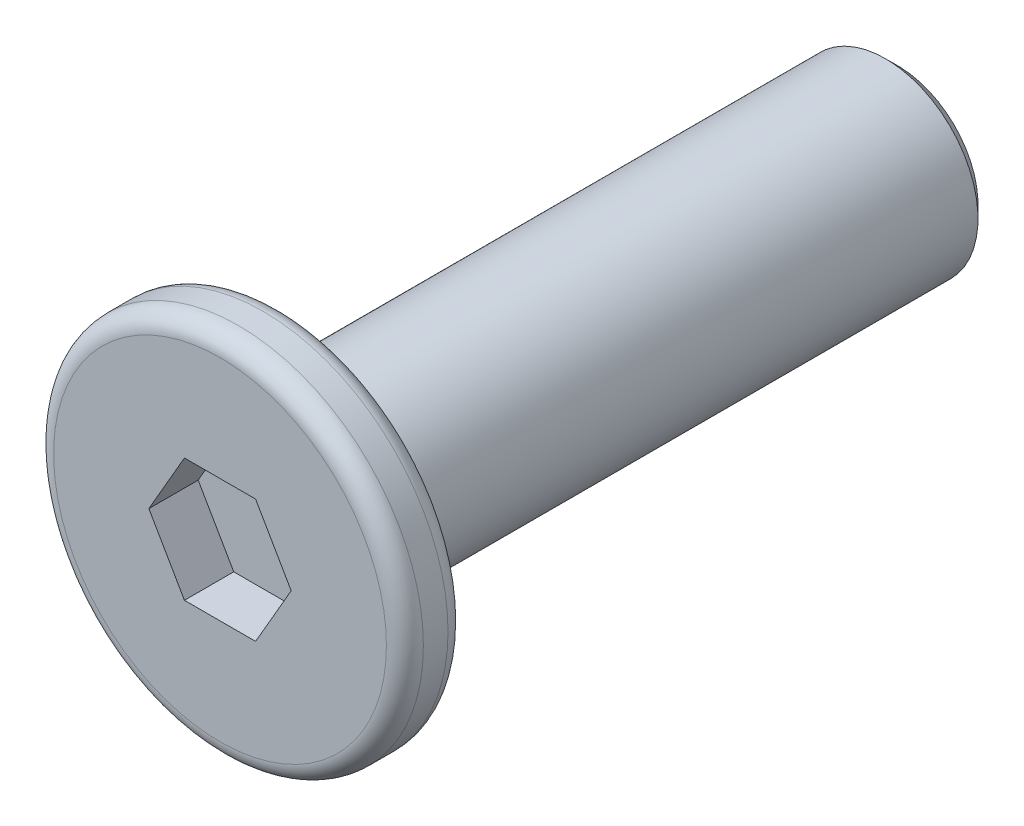
ISO-10303-21;
HEADER;
FILE_DESCRIPTION(('STEP AP214'),'2;1');
FILE_NAME('part.step','',(''),(''),'','','');
FILE_SCHEMA(('AUTOMOTIVE_DESIGN { 1 0 10303 214 1 1 1 1 }'));
ENDSEC;
DATA;
#1=APPLICATION_CONTEXT('core data for automotive mechanical design processes');
#2=APPLICATION_PROTOCOL_DEFINITION('international standard','automotive_design',2000,#1);
#3=PRODUCT_CONTEXT('',#1,'mechanical');
#4=PRODUCT('Part','Part','',(#3));
#5=PRODUCT_RELATED_PRODUCT_CATEGORY('part','',(#4));
#6=PRODUCT_DEFINITION_FORMATION('','',#4);
#7=PRODUCT_DEFINITION_CONTEXT('part definition',#1,'design');
#8=PRODUCT_DEFINITION('design','',#6,#7);
#9=PRODUCT_DEFINITION_SHAPE('','',#8);
#10=(LENGTH_UNIT() NAMED_UNIT(*) SI_UNIT(.MILLI.,.METRE.));
#11=(NAMED_UNIT(*) PLANE_ANGLE_UNIT() SI_UNIT($,.RADIAN.));
#12=(NAMED_UNIT(*) SI_UNIT($,.STERADIAN.) SOLID_ANGLE_UNIT());
#13=UNCERTAINTY_MEASURE_WITH_UNIT(LENGTH_MEASURE(1.E-05),#10,'distance_accuracy_value','');
#14=(GEOMETRIC_REPRESENTATION_CONTEXT(3) GLOBAL_UNCERTAINTY_ASSIGNED_CONTEXT((#13)) GLOBAL_UNIT_ASSIGNED_CONTEXT((#10,
#11,#12)) REPRESENTATION_CONTEXT('',''));
#15=CARTESIAN_POINT('',(0.,0.,0.));
#16=DIRECTION('',(0.,0.,1.));
#17=DIRECTION('',(1.,0.,0.));
#18=AXIS2_PLACEMENT_3D('',#15,#16,#17);
#19=CARTESIAN_POINT('',(0.,0.,0.5));
#20=DIRECTION('',(0.,0.,-1.));
#21=DIRECTION('',(-1.,0.,0.));
#22=AXIS2_PLACEMENT_3D('',#19,#20,#21);
#23=CYLINDRICAL_SURFACE('',#22,3.);
#24=CARTESIAN_POINT('',(0.,0.,-0.2));
#25=DIRECTION('',(0.,0.,1.));
#26=DIRECTION('',(1.,0.,0.));
#27=AXIS2_PLACEMENT_3D('',#24,#25,#26);
#28=CIRCLE('',#27,3.);
#29=CARTESIAN_POINT('',(3.,0.,-0.2));
#30=VERTEX_POINT('',#29);
#31=EDGE_CURVE('E154',#30,#30,#28,.T.);
#32=ORIENTED_EDGE('',*,*,#31,.T.);
#33=EDGE_LOOP('',(#32));
#34=FACE_BOUND('',#33,.T.);
#35=CARTESIAN_POINT('',(0.,0.,0.2));
#36=DIRECTION('',(0.,0.,1.));
#37=DIRECTION('',(1.,0.,0.));
#38=AXIS2_PLACEMENT_3D('',#35,#36,#37);
#39=CIRCLE('',#38,3.);
#40=CARTESIAN_POINT('',(3.,0.,0.2));
#41=VERTEX_POINT('',#40);
#42=EDGE_CURVE('E151',#41,#41,#39,.F.);
#43=ORIENTED_EDGE('',*,*,#42,.T.);
#44=EDGE_LOOP('',(#43));
#45=FACE_BOUND('',#44,.T.);
#46=ADVANCED_FACE('F35',(#34,#45),#23,.T.);
#47=CARTESIAN_POINT('',(0.,0.,0.5));
#48=DIRECTION('',(0.,0.,1.));
#49=DIRECTION('',(1.,0.,0.));
#50=AXIS2_PLACEMENT_3D('',#47,#48,#49);
#51=PLANE('',#50);
#52=CARTESIAN_POINT('',(0.,0.,0.5));
#53=DIRECTION('',(0.,0.,1.));
#54=DIRECTION('',(1.,0.,0.));
#55=AXIS2_PLACEMENT_3D('',#52,#53,#54);
#56=CIRCLE('',#55,2.7);
#57=CARTESIAN_POINT('',(2.7,0.,0.5));
#58=VERTEX_POINT('',#57);
#59=EDGE_CURVE('E11',#58,#58,#56,.T.);
#60=ORIENTED_EDGE('',*,*,#59,.T.);
#61=EDGE_LOOP('',(#60));
#62=FACE_BOUND('',#61,.T.);
#63=DIRECTION('',(0.5,0.866025403784439,0.));
#64=VECTOR('',#63,1.);
#65=CARTESIAN_POINT('',(0.577350269189626,-1.,0.5));
#66=LINE('',#65,#64);
#67=CARTESIAN_POINT('',(0.577350269189626,-1.,0.5));
#68=VERTEX_POINT('',#67);
#69=CARTESIAN_POINT('',(1.15470053837925,0.,0.5));
#70=VERTEX_POINT('',#69);
#71=EDGE_CURVE('E50',#68,#70,#66,.T.);
#72=ORIENTED_EDGE('',*,*,#71,.F.);
#73=DIRECTION('',(1.,0.,0.));
#74=VECTOR('',#73,1.);
#75=CARTESIAN_POINT('',(-0.577350269189625,-1.,0.5));
#76=LINE('',#75,#74);
#77=CARTESIAN_POINT('',(-0.577350269189625,-1.,0.5));
#78=VERTEX_POINT('',#77);
#79=EDGE_CURVE('E133',#78,#68,#76,.T.);
#80=ORIENTED_EDGE('',*,*,#79,.F.);
#81=DIRECTION('',(0.5,-0.866025403784438,0.));
#82=VECTOR('',#81,1.);
#83=CARTESIAN_POINT('',(-1.15470053837925,0.,0.5));
#84=LINE('',#83,#82);
#85=CARTESIAN_POINT('',(-1.15470053837925,0.,0.5));
#86=VERTEX_POINT('',#85);
#87=EDGE_CURVE('E131',#86,#78,#84,.T.);
#88=ORIENTED_EDGE('',*,*,#87,.F.);
#89=DIRECTION('',(-0.5,-0.866025403784438,0.));
#90=VECTOR('',#89,1.);
#91=CARTESIAN_POINT('',(-0.577350269189626,1.,0.5));
#92=LINE('',#91,#90);
#93=CARTESIAN_POINT('',(-0.577350269189626,1.,0.5));
#94=VERTEX_POINT('',#93);
#95=EDGE_CURVE('E98',#94,#86,#92,.T.);
#96=ORIENTED_EDGE('',*,*,#95,.F.);
#97=DIRECTION('',(-1.,0.,0.));
#98=VECTOR('',#97,1.);
#99=CARTESIAN_POINT('',(0.577350269189625,1.,0.5));
#100=LINE('',#99,#98);
#101=CARTESIAN_POINT('',(0.577350269189625,1.,0.5));
#102=VERTEX_POINT('',#101);
#103=EDGE_CURVE('E127',#102,#94,#100,.T.);
#104=ORIENTED_EDGE('',*,*,#103,.F.);
#105=DIRECTION('',(-0.5,0.866025403784438,0.));
#106=VECTOR('',#105,1.);
#107=CARTESIAN_POINT('',(1.15470053837925,0.,0.5));
#108=LINE('',#107,#106);
#109=EDGE_CURVE('E124',#70,#102,#108,.T.);
#110=ORIENTED_EDGE('',*,*,#109,.F.);
#111=EDGE_LOOP('',(#72,#80,#88,#96,#104,#110));
#112=FACE_BOUND('',#111,.T.);
#113=ADVANCED_FACE('F169',(#62,#112),#51,.T.);
#114=CARTESIAN_POINT('',(0.,0.,-0.5));
#115=DIRECTION('',(0.,0.,1.));
#116=DIRECTION('',(1.,0.,0.));
#117=AXIS2_PLACEMENT_3D('',#114,#115,#116);
#118=PLANE('',#117);
#119=CARTESIAN_POINT('',(0.,0.,-0.5));
#120=DIRECTION('',(0.,0.,1.));
#121=DIRECTION('',(1.,0.,0.));
#122=AXIS2_PLACEMENT_3D('',#119,#120,#121);
#123=CIRCLE('',#122,2.7);
#124=CARTESIAN_POINT('',(2.7,0.,-0.5));
#125=VERTEX_POINT('',#124);
#126=EDGE_CURVE('E43',#125,#125,#123,.F.);
#127=ORIENTED_EDGE('',*,*,#126,.T.);
#128=EDGE_LOOP('',(#127));
#129=FACE_BOUND('',#128,.T.);
#130=CARTESIAN_POINT('',(0.,0.,-0.5));
#131=DIRECTION('',(0.,0.,-1.));
#132=DIRECTION('',(-1.,0.,0.));
#133=AXIS2_PLACEMENT_3D('',#130,#131,#132);
#134=CIRCLE('',#133,1.5);
#135=CARTESIAN_POINT('',(-1.5,0.,-0.5));
#136=VERTEX_POINT('',#135);
#137=EDGE_CURVE('E137',#136,#136,#134,.T.);
#138=ORIENTED_EDGE('',*,*,#137,.F.);
#139=EDGE_LOOP('',(#138));
#140=FACE_BOUND('',#139,.T.);
#141=ADVANCED_FACE('F159',(#129,#140),#118,.F.);
#142=CARTESIAN_POINT('',(0.,0.,-10.5));
#143=DIRECTION('',(0.,0.,1.));
#144=DIRECTION('',(1.,0.,0.));
#145=AXIS2_PLACEMENT_3D('',#142,#143,#144);
#146=CYLINDRICAL_SURFACE('',#145,1.5);
#147=CARTESIAN_POINT('',(0.,0.,-10.3));
#148=DIRECTION('',(0.,0.,-1.));
#149=DIRECTION('',(-1.,0.,0.));
#150=AXIS2_PLACEMENT_3D('',#147,#148,#149);
#151=CIRCLE('',#150,1.5);
#152=CARTESIAN_POINT('',(-1.5,0.,-10.3));
#153=VERTEX_POINT('',#152);
#154=EDGE_CURVE('E148',#153,#153,#151,.F.);
#155=ORIENTED_EDGE('',*,*,#154,.T.);
#156=EDGE_LOOP('',(#155));
#157=FACE_BOUND('',#156,.T.);
#158=ORIENTED_EDGE('',*,*,#137,.T.);
#159=EDGE_LOOP('',(#158));
#160=FACE_BOUND('',#159,.T.);
#161=ADVANCED_FACE('F204',(#157,#160),#146,.T.);
#162=CARTESIAN_POINT('',(0.,0.,-10.5));
#163=DIRECTION('',(0.,0.,-1.));
#164=DIRECTION('',(-1.,0.,0.));
#165=AXIS2_PLACEMENT_3D('',#162,#163,#164);
#166=PLANE('',#165);
#167=CARTESIAN_POINT('',(0.,0.,-10.5));
#168=DIRECTION('',(0.,0.,-1.));
#169=DIRECTION('',(-1.,0.,0.));
#170=AXIS2_PLACEMENT_3D('',#167,#168,#169);
#171=CIRCLE('',#170,1.3);
#172=CARTESIAN_POINT('',(-1.3,0.,-10.5));
#173=VERTEX_POINT('',#172);
#174=EDGE_CURVE('E145',#173,#173,#171,.T.);
#175=ORIENTED_EDGE('',*,*,#174,.T.);
#176=EDGE_LOOP('',(#175));
#177=FACE_BOUND('',#176,.T.);
#178=ADVANCED_FACE('F196',(#177),#166,.T.);
#179=CARTESIAN_POINT('',(0.,0.,-10.5));
#180=DIRECTION('',(0.,0.,1.));
#181=DIRECTION('',(1.,0.,0.));
#182=AXIS2_PLACEMENT_3D('',#179,#180,#181);
#183=CONICAL_SURFACE('',#182,1.3,0.785398163397446);
#184=ORIENTED_EDGE('',*,*,#154,.F.);
#185=EDGE_LOOP('',(#184));
#186=FACE_BOUND('',#185,.T.);
#187=ORIENTED_EDGE('',*,*,#174,.F.);
#188=EDGE_LOOP('',(#187));
#189=FACE_BOUND('',#188,.T.);
#190=ADVANCED_FACE('F189',(#186,#189),#183,.T.);
#191=CARTESIAN_POINT('',(0.577350269189626,-1.,-0.3));
#192=DIRECTION('',(0.866025403784439,-0.5,0.));
#193=DIRECTION('',(0.5,0.866025403784439,0.));
#194=AXIS2_PLACEMENT_3D('',#191,#192,#193);
#195=PLANE('',#194);
#196=ORIENTED_EDGE('',*,*,#71,.T.);
#197=DIRECTION('',(0.,0.,1.));
#198=VECTOR('',#197,1.);
#199=CARTESIAN_POINT('',(1.15470053837925,0.,-0.3));
#200=LINE('',#199,#198);
#201=CARTESIAN_POINT('',(1.15470053837925,0.,-0.3));
#202=VERTEX_POINT('',#201);
#203=EDGE_CURVE('E80',#202,#70,#200,.T.);
#204=ORIENTED_EDGE('',*,*,#203,.F.);
#205=DIRECTION('',(0.5,0.866025403784439,0.));
#206=VECTOR('',#205,1.);
#207=CARTESIAN_POINT('',(0.577350269189626,-1.,-0.3));
#208=LINE('',#207,#206);
#209=CARTESIAN_POINT('',(0.577350269189626,-1.,-0.3));
#210=VERTEX_POINT('',#209);
#211=EDGE_CURVE('E135',#210,#202,#208,.T.);
#212=ORIENTED_EDGE('',*,*,#211,.F.);
#213=DIRECTION('',(0.,0.,1.));
#214=VECTOR('',#213,1.);
#215=CARTESIAN_POINT('',(0.577350269189626,-1.,-0.3));
#216=LINE('',#215,#214);
#217=EDGE_CURVE('E58',#210,#68,#216,.T.);
#218=ORIENTED_EDGE('',*,*,#217,.T.);
#219=EDGE_LOOP('',(#196,#204,#212,#218));
#220=FACE_BOUND('',#219,.T.);
#221=ADVANCED_FACE('F186',(#220),#195,.F.);
#222=CARTESIAN_POINT('',(-0.577350269189625,-1.,-0.3));
#223=DIRECTION('',(0.,-1.,0.));
#224=DIRECTION('',(1.,0.,0.));
#225=AXIS2_PLACEMENT_3D('',#222,#223,#224);
#226=PLANE('',#225);
#227=ORIENTED_EDGE('',*,*,#79,.T.);
#228=ORIENTED_EDGE('',*,*,#217,.F.);
#229=DIRECTION('',(1.,0.,0.));
#230=VECTOR('',#229,1.);
#231=CARTESIAN_POINT('',(-0.577350269189625,-1.,-0.3));
#232=LINE('',#231,#230);
#233=CARTESIAN_POINT('',(-0.577350269189625,-1.,-0.3));
#234=VERTEX_POINT('',#233);
#235=EDGE_CURVE('E110',#234,#210,#232,.T.);
#236=ORIENTED_EDGE('',*,*,#235,.F.);
#237=DIRECTION('',(0.,0.,1.));
#238=VECTOR('',#237,1.);
#239=CARTESIAN_POINT('',(-0.577350269189625,-1.,-0.3));
#240=LINE('',#239,#238);
#241=EDGE_CURVE('E102',#234,#78,#240,.T.);
#242=ORIENTED_EDGE('',*,*,#241,.T.);
#243=EDGE_LOOP('',(#227,#228,#236,#242));
#244=FACE_BOUND('',#243,.T.);
#245=ADVANCED_FACE('F188',(#244),#226,.F.);
#246=CARTESIAN_POINT('',(-1.15470053837925,0.,-0.3));
#247=DIRECTION('',(-0.866025403784438,-0.5,0.));
#248=DIRECTION('',(0.5,-0.866025403784438,0.));
#249=AXIS2_PLACEMENT_3D('',#246,#247,#248);
#250=PLANE('',#249);
#251=ORIENTED_EDGE('',*,*,#87,.T.);
#252=ORIENTED_EDGE('',*,*,#241,.F.);
#253=DIRECTION('',(0.5,-0.866025403784438,0.));
#254=VECTOR('',#253,1.);
#255=CARTESIAN_POINT('',(-1.15470053837925,0.,-0.3));
#256=LINE('',#255,#254);
#257=CARTESIAN_POINT('',(-1.15470053837925,0.,-0.3));
#258=VERTEX_POINT('',#257);
#259=EDGE_CURVE('E106',#258,#234,#256,.T.);
#260=ORIENTED_EDGE('',*,*,#259,.F.);
#261=DIRECTION('',(0.,0.,1.));
#262=VECTOR('',#261,1.);
#263=CARTESIAN_POINT('',(-1.15470053837925,0.,-0.3));
#264=LINE('',#263,#262);
#265=EDGE_CURVE('E91',#258,#86,#264,.T.);
#266=ORIENTED_EDGE('',*,*,#265,.T.);
#267=EDGE_LOOP('',(#251,#252,#260,#266));
#268=FACE_BOUND('',#267,.T.);
#269=ADVANCED_FACE('F107',(#268),#250,.F.);
#270=CARTESIAN_POINT('',(-0.577350269189626,1.,-0.3));
#271=DIRECTION('',(-0.866025403784438,0.5,0.));
#272=DIRECTION('',(-0.5,-0.866025403784439,0.));
#273=AXIS2_PLACEMENT_3D('',#270,#271,#272);
#274=PLANE('',#273);
#275=ORIENTED_EDGE('',*,*,#95,.T.);
#276=ORIENTED_EDGE('',*,*,#265,.F.);
#277=DIRECTION('',(-0.5,-0.866025403784438,0.));
#278=VECTOR('',#277,1.);
#279=CARTESIAN_POINT('',(-0.577350269189626,1.,-0.3));
#280=LINE('',#279,#278);
#281=CARTESIAN_POINT('',(-0.577350269189626,1.,-0.3));
#282=VERTEX_POINT('',#281);
#283=EDGE_CURVE('E95',#282,#258,#280,.T.);
#284=ORIENTED_EDGE('',*,*,#283,.F.);
#285=DIRECTION('',(0.,0.,1.));
#286=VECTOR('',#285,1.);
#287=CARTESIAN_POINT('',(-0.577350269189626,1.,-0.3));
#288=LINE('',#287,#286);
#289=EDGE_CURVE('E103',#282,#94,#288,.T.);
#290=ORIENTED_EDGE('',*,*,#289,.T.);
#291=EDGE_LOOP('',(#275,#276,#284,#290));
#292=FACE_BOUND('',#291,.T.);
#293=ADVANCED_FACE('F93',(#292),#274,.F.);
#294=CARTESIAN_POINT('',(0.577350269189625,1.,-0.3));
#295=DIRECTION('',(0.,1.,0.));
#296=DIRECTION('',(0.,0.,1.));
#297=AXIS2_PLACEMENT_3D('',#294,#295,#296);
#298=PLANE('',#297);
#299=ORIENTED_EDGE('',*,*,#103,.T.);
#300=ORIENTED_EDGE('',*,*,#289,.F.);
#301=DIRECTION('',(-1.,0.,0.));
#302=VECTOR('',#301,1.);
#303=CARTESIAN_POINT('',(0.577350269189625,1.,-0.3));
#304=LINE('',#303,#302);
#305=CARTESIAN_POINT('',(0.577350269189625,1.,-0.3));
#306=VERTEX_POINT('',#305);
#307=EDGE_CURVE('E116',#306,#282,#304,.T.);
#308=ORIENTED_EDGE('',*,*,#307,.F.);
#309=DIRECTION('',(0.,0.,1.));
#310=VECTOR('',#309,1.);
#311=CARTESIAN_POINT('',(0.577350269189625,1.,-0.3));
#312=LINE('',#311,#310);
#313=EDGE_CURVE('E140',#306,#102,#312,.T.);
#314=ORIENTED_EDGE('',*,*,#313,.T.);
#315=EDGE_LOOP('',(#299,#300,#308,#314));
#316=FACE_BOUND('',#315,.T.);
#317=ADVANCED_FACE('F257',(#316),#298,.F.);
#318=CARTESIAN_POINT('',(1.15470053837925,0.,-0.3));
#319=DIRECTION('',(0.866025403784438,0.5,0.));
#320=DIRECTION('',(-0.5,0.866025403784439,0.));
#321=AXIS2_PLACEMENT_3D('',#318,#319,#320);
#322=PLANE('',#321);
#323=ORIENTED_EDGE('',*,*,#109,.T.);
#324=ORIENTED_EDGE('',*,*,#313,.F.);
#325=DIRECTION('',(-0.5,0.866025403784438,0.));
#326=VECTOR('',#325,1.);
#327=CARTESIAN_POINT('',(1.15470053837925,0.,-0.3));
#328=LINE('',#327,#326);
#329=EDGE_CURVE('E118',#202,#306,#328,.T.);
#330=ORIENTED_EDGE('',*,*,#329,.F.);
#331=ORIENTED_EDGE('',*,*,#203,.T.);
#332=EDGE_LOOP('',(#323,#324,#330,#331));
#333=FACE_BOUND('',#332,.T.);
#334=ADVANCED_FACE('F184',(#333),#322,.F.);
#335=CARTESIAN_POINT('',(0.,0.,-0.3));
#336=DIRECTION('',(0.,0.,1.));
#337=DIRECTION('',(1.,0.,0.));
#338=AXIS2_PLACEMENT_3D('',#335,#336,#337);
#339=PLANE('',#338);
#340=ORIENTED_EDGE('',*,*,#211,.T.);
#341=ORIENTED_EDGE('',*,*,#329,.T.);
#342=ORIENTED_EDGE('',*,*,#307,.T.);
#343=ORIENTED_EDGE('',*,*,#283,.T.);
#344=ORIENTED_EDGE('',*,*,#259,.T.);
#345=ORIENTED_EDGE('',*,*,#235,.T.);
#346=EDGE_LOOP('',(#340,#341,#342,#343,#344,#345));
#347=FACE_BOUND('',#346,.T.);
#348=ADVANCED_FACE('F113',(#347),#339,.T.);
#349=CARTESIAN_POINT('',(0.,0.,-0.2));
#350=DIRECTION('',(0.,0.,1.));
#351=DIRECTION('',(1.,0.,0.));
#352=AXIS2_PLACEMENT_3D('',#349,#350,#351);
#353=TOROIDAL_SURFACE('',#352,2.7,0.3);
#354=ORIENTED_EDGE('',*,*,#126,.F.);
#355=EDGE_LOOP('',(#354));
#356=FACE_BOUND('',#355,.T.);
#357=ORIENTED_EDGE('',*,*,#31,.F.);
#358=EDGE_LOOP('',(#357));
#359=FACE_BOUND('',#358,.T.);
#360=ADVANCED_FACE('F162',(#356,#359),#353,.T.);
#361=CARTESIAN_POINT('',(0.,0.,0.2));
#362=DIRECTION('',(0.,0.,1.));
#363=DIRECTION('',(1.,0.,0.));
#364=AXIS2_PLACEMENT_3D('',#361,#362,#363);
#365=TOROIDAL_SURFACE('',#364,2.7,0.3);
#366=ORIENTED_EDGE('',*,*,#42,.F.);
#367=EDGE_LOOP('',(#366));
#368=FACE_BOUND('',#367,.T.);
#369=ORIENTED_EDGE('',*,*,#59,.F.);
#370=EDGE_LOOP('',(#369));
#371=FACE_BOUND('',#370,.T.);
#372=ADVANCED_FACE('F37',(#368,#371),#365,.T.);
#373=CLOSED_SHELL('',(#46,#113,#141,#161,#178,#190,#221,#245,#269,#293,#317,#334,#348,#360,#372));
#374=MANIFOLD_SOLID_BREP('B2',#373);
#375=ADVANCED_BREP_SHAPE_REPRESENTATION('',(#18,#374),#14);
#376=SHAPE_DEFINITION_REPRESENTATION(#9,#375);
ENDSEC;
END-ISO-10303-21;
